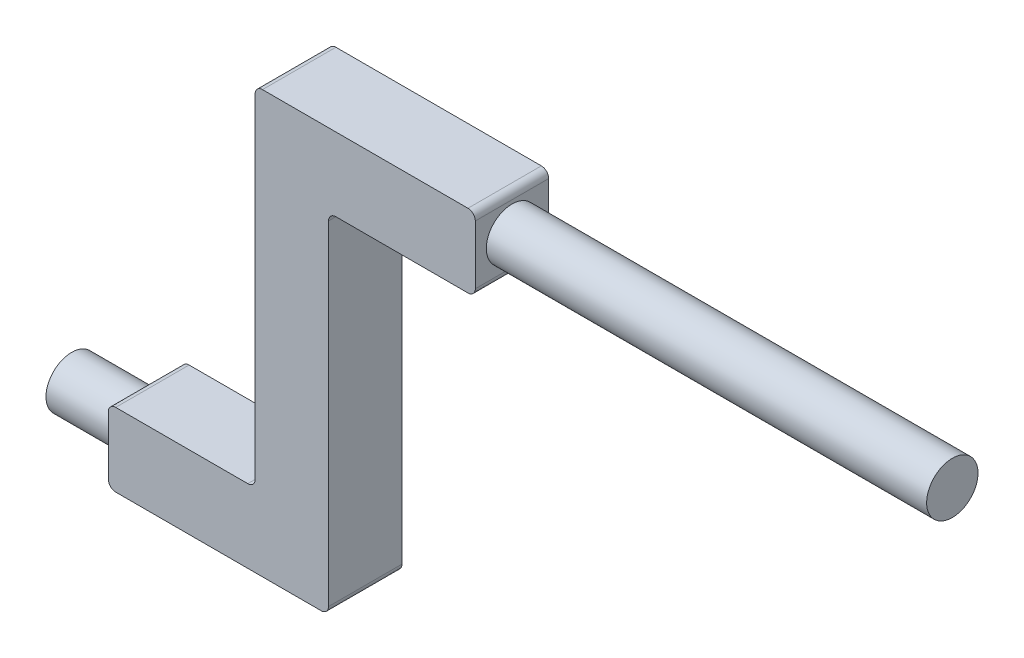
ISO-10303-21;
HEADER;
FILE_DESCRIPTION(('STEP AP214'),'2;1');
FILE_NAME('part.step','',(''),(''),'','','');
FILE_SCHEMA(('AUTOMOTIVE_DESIGN { 1 0 10303 214 1 1 1 1 }'));
ENDSEC;
DATA;
#1=APPLICATION_CONTEXT('core data for automotive mechanical design processes');
#2=APPLICATION_PROTOCOL_DEFINITION('international standard','automotive_design',2000,#1);
#3=PRODUCT_CONTEXT('',#1,'mechanical');
#4=PRODUCT('Part','Part','',(#3));
#5=PRODUCT_RELATED_PRODUCT_CATEGORY('part','',(#4));
#6=PRODUCT_DEFINITION_FORMATION('','',#4);
#7=PRODUCT_DEFINITION_CONTEXT('part definition',#1,'design');
#8=PRODUCT_DEFINITION('design','',#6,#7);
#9=PRODUCT_DEFINITION_SHAPE('','',#8);
#10=(LENGTH_UNIT() NAMED_UNIT(*) SI_UNIT(.MILLI.,.METRE.));
#11=(NAMED_UNIT(*) PLANE_ANGLE_UNIT() SI_UNIT($,.RADIAN.));
#12=(NAMED_UNIT(*) SI_UNIT($,.STERADIAN.) SOLID_ANGLE_UNIT());
#13=UNCERTAINTY_MEASURE_WITH_UNIT(LENGTH_MEASURE(1.E-05),#10,'distance_accuracy_value','');
#14=(GEOMETRIC_REPRESENTATION_CONTEXT(3) GLOBAL_UNCERTAINTY_ASSIGNED_CONTEXT((#13)) GLOBAL_UNIT_ASSIGNED_CONTEXT((#10,
#11,#12)) REPRESENTATION_CONTEXT('',''));
#15=CARTESIAN_POINT('',(0.,0.,0.));
#16=DIRECTION('',(0.,0.,1.));
#17=DIRECTION('',(1.,0.,0.));
#18=AXIS2_PLACEMENT_3D('',#15,#16,#17);
#19=CARTESIAN_POINT('',(19.,32.75,10.));
#20=DIRECTION('',(0.,0.,-1.));
#21=DIRECTION('',(-1.,0.,0.));
#22=AXIS2_PLACEMENT_3D('',#19,#20,#21);
#23=CYLINDRICAL_SURFACE('',#22,1.00000000000001);
#24=CARTESIAN_POINT('',(19.,32.75,0.));
#25=DIRECTION('',(0.,0.,1.));
#26=DIRECTION('',(-1.,0.,0.));
#27=AXIS2_PLACEMENT_3D('',#24,#25,#26);
#28=CIRCLE('',#27,1.00000000000001);
#29=CARTESIAN_POINT('',(20.,32.75,0.));
#30=VERTEX_POINT('',#29);
#31=CARTESIAN_POINT('',(19.,33.75,0.));
#32=VERTEX_POINT('',#31);
#33=EDGE_CURVE('E180',#30,#32,#28,.T.);
#34=ORIENTED_EDGE('',*,*,#33,.T.);
#35=DIRECTION('',(0.,0.,-1.));
#36=VECTOR('',#35,1.);
#37=CARTESIAN_POINT('',(19.,33.75,10.));
#38=LINE('',#37,#36);
#39=CARTESIAN_POINT('',(19.,33.75,10.));
#40=VERTEX_POINT('',#39);
#41=EDGE_CURVE('E248',#40,#32,#38,.T.);
#42=ORIENTED_EDGE('',*,*,#41,.F.);
#43=CARTESIAN_POINT('',(19.,32.75,10.));
#44=DIRECTION('',(0.,0.,1.));
#45=DIRECTION('',(-1.,0.,0.));
#46=AXIS2_PLACEMENT_3D('',#43,#44,#45);
#47=CIRCLE('',#46,1.00000000000001);
#48=CARTESIAN_POINT('',(20.,32.75,10.));
#49=VERTEX_POINT('',#48);
#50=EDGE_CURVE('E211',#49,#40,#47,.T.);
#51=ORIENTED_EDGE('',*,*,#50,.F.);
#52=DIRECTION('',(0.,0.,-1.));
#53=VECTOR('',#52,1.);
#54=CARTESIAN_POINT('',(20.,32.75,10.));
#55=LINE('',#54,#53);
#56=EDGE_CURVE('E176',#49,#30,#55,.T.);
#57=ORIENTED_EDGE('',*,*,#56,.T.);
#58=EDGE_LOOP('',(#34,#42,#51,#57));
#59=FACE_BOUND('',#58,.T.);
#60=ADVANCED_FACE('F35',(#59),#23,.T.);
#61=CARTESIAN_POINT('',(19.,33.75,10.));
#62=DIRECTION('',(0.,-1.,0.));
#63=DIRECTION('',(1.,0.,0.));
#64=AXIS2_PLACEMENT_3D('',#61,#62,#63);
#65=PLANE('',#64);
#66=DIRECTION('',(-1.,0.,0.));
#67=VECTOR('',#66,1.);
#68=CARTESIAN_POINT('',(19.,33.75,0.));
#69=LINE('',#68,#67);
#70=CARTESIAN_POINT('',(-8.99999999999998,33.75,0.));
#71=VERTEX_POINT('',#70);
#72=EDGE_CURVE('E183',#32,#71,#69,.T.);
#73=ORIENTED_EDGE('',*,*,#72,.T.);
#74=DIRECTION('',(0.,0.,-1.));
#75=VECTOR('',#74,1.);
#76=CARTESIAN_POINT('',(-8.99999999999998,33.75,10.));
#77=LINE('',#76,#75);
#78=CARTESIAN_POINT('',(-8.99999999999998,33.75,10.));
#79=VERTEX_POINT('',#78);
#80=EDGE_CURVE('E245',#79,#71,#77,.T.);
#81=ORIENTED_EDGE('',*,*,#80,.F.);
#82=DIRECTION('',(-1.,0.,0.));
#83=VECTOR('',#82,1.);
#84=CARTESIAN_POINT('',(19.,33.75,10.));
#85=LINE('',#84,#83);
#86=EDGE_CURVE('E119',#40,#79,#85,.T.);
#87=ORIENTED_EDGE('',*,*,#86,.F.);
#88=ORIENTED_EDGE('',*,*,#41,.T.);
#89=EDGE_LOOP('',(#73,#81,#87,#88));
#90=FACE_BOUND('',#89,.T.);
#91=ADVANCED_FACE('F266',(#90),#65,.F.);
#92=CARTESIAN_POINT('',(-8.99999999999998,32.75,10.));
#93=DIRECTION('',(0.,0.,-1.));
#94=DIRECTION('',(-1.,0.,0.));
#95=AXIS2_PLACEMENT_3D('',#92,#93,#94);
#96=CYLINDRICAL_SURFACE('',#95,0.999999999999997);
#97=CARTESIAN_POINT('',(-8.99999999999998,32.75,0.));
#98=DIRECTION('',(0.,0.,1.));
#99=DIRECTION('',(1.,0.,0.));
#100=AXIS2_PLACEMENT_3D('',#97,#98,#99);
#101=CIRCLE('',#100,0.999999999999997);
#102=CARTESIAN_POINT('',(-9.99999999999997,32.75,0.));
#103=VERTEX_POINT('',#102);
#104=EDGE_CURVE('E186',#71,#103,#101,.T.);
#105=ORIENTED_EDGE('',*,*,#104,.T.);
#106=DIRECTION('',(0.,0.,-1.));
#107=VECTOR('',#106,1.);
#108=CARTESIAN_POINT('',(-9.99999999999997,32.75,10.));
#109=LINE('',#108,#107);
#110=CARTESIAN_POINT('',(-9.99999999999997,32.75,10.));
#111=VERTEX_POINT('',#110);
#112=EDGE_CURVE('E242',#111,#103,#109,.T.);
#113=ORIENTED_EDGE('',*,*,#112,.F.);
#114=CARTESIAN_POINT('',(-8.99999999999998,32.75,10.));
#115=DIRECTION('',(0.,0.,1.));
#116=DIRECTION('',(1.,0.,0.));
#117=AXIS2_PLACEMENT_3D('',#114,#115,#116);
#118=CIRCLE('',#117,0.999999999999997);
#119=EDGE_CURVE('E281',#79,#111,#118,.T.);
#120=ORIENTED_EDGE('',*,*,#119,.F.);
#121=ORIENTED_EDGE('',*,*,#80,.T.);
#122=EDGE_LOOP('',(#105,#113,#120,#121));
#123=FACE_BOUND('',#122,.T.);
#124=ADVANCED_FACE('F271',(#123),#96,.T.);
#125=CARTESIAN_POINT('',(-9.99999999999998,32.75,10.));
#126=DIRECTION('',(1.,0.,0.));
#127=DIRECTION('',(0.,1.,0.));
#128=AXIS2_PLACEMENT_3D('',#125,#126,#127);
#129=PLANE('',#128);
#130=DIRECTION('',(0.,-1.,0.));
#131=VECTOR('',#130,1.);
#132=CARTESIAN_POINT('',(-9.99999999999998,32.75,0.));
#133=LINE('',#132,#131);
#134=CARTESIAN_POINT('',(-9.99999999999996,-12.75,0.));
#135=VERTEX_POINT('',#134);
#136=EDGE_CURVE('E188',#103,#135,#133,.T.);
#137=ORIENTED_EDGE('',*,*,#136,.T.);
#138=DIRECTION('',(0.,0.,-1.));
#139=VECTOR('',#138,1.);
#140=CARTESIAN_POINT('',(-9.99999999999996,-12.75,10.));
#141=LINE('',#140,#139);
#142=CARTESIAN_POINT('',(-9.99999999999996,-12.75,10.));
#143=VERTEX_POINT('',#142);
#144=EDGE_CURVE('E239',#143,#135,#141,.T.);
#145=ORIENTED_EDGE('',*,*,#144,.F.);
#146=DIRECTION('',(0.,-1.,0.));
#147=VECTOR('',#146,1.);
#148=CARTESIAN_POINT('',(-9.99999999999998,32.75,10.));
#149=LINE('',#148,#147);
#150=EDGE_CURVE('E283',#111,#143,#149,.T.);
#151=ORIENTED_EDGE('',*,*,#150,.F.);
#152=ORIENTED_EDGE('',*,*,#112,.T.);
#153=EDGE_LOOP('',(#137,#145,#151,#152));
#154=FACE_BOUND('',#153,.T.);
#155=ADVANCED_FACE('F349',(#154),#129,.F.);
#156=CARTESIAN_POINT('',(-11.,-12.75,10.));
#157=DIRECTION('',(0.,0.,-1.));
#158=DIRECTION('',(-1.,0.,0.));
#159=AXIS2_PLACEMENT_3D('',#156,#157,#158);
#160=CYLINDRICAL_SURFACE('',#159,0.999999999999999);
#161=CARTESIAN_POINT('',(-11.,-12.75,0.));
#162=DIRECTION('',(0.,0.,-1.));
#163=DIRECTION('',(-1.,0.,0.));
#164=AXIS2_PLACEMENT_3D('',#161,#162,#163);
#165=CIRCLE('',#164,0.999999999999999);
#166=CARTESIAN_POINT('',(-11.,-13.75,0.));
#167=VERTEX_POINT('',#166);
#168=EDGE_CURVE('E190',#135,#167,#165,.T.);
#169=ORIENTED_EDGE('',*,*,#168,.T.);
#170=DIRECTION('',(0.,0.,-1.));
#171=VECTOR('',#170,1.);
#172=CARTESIAN_POINT('',(-11.,-13.75,10.));
#173=LINE('',#172,#171);
#174=CARTESIAN_POINT('',(-11.,-13.75,10.));
#175=VERTEX_POINT('',#174);
#176=EDGE_CURVE('E236',#175,#167,#173,.T.);
#177=ORIENTED_EDGE('',*,*,#176,.F.);
#178=CARTESIAN_POINT('',(-11.,-12.75,10.));
#179=DIRECTION('',(0.,0.,-1.));
#180=DIRECTION('',(-1.,0.,0.));
#181=AXIS2_PLACEMENT_3D('',#178,#179,#180);
#182=CIRCLE('',#181,0.999999999999999);
#183=EDGE_CURVE('E285',#143,#175,#182,.T.);
#184=ORIENTED_EDGE('',*,*,#183,.F.);
#185=ORIENTED_EDGE('',*,*,#144,.T.);
#186=EDGE_LOOP('',(#169,#177,#184,#185));
#187=FACE_BOUND('',#186,.T.);
#188=ADVANCED_FACE('F345',(#187),#160,.F.);
#189=CARTESIAN_POINT('',(-11.,-13.75,10.));
#190=DIRECTION('',(0.,-1.,0.));
#191=DIRECTION('',(1.,0.,0.));
#192=AXIS2_PLACEMENT_3D('',#189,#190,#191);
#193=PLANE('',#192);
#194=DIRECTION('',(-1.,0.,0.));
#195=VECTOR('',#194,1.);
#196=CARTESIAN_POINT('',(-11.,-13.75,0.));
#197=LINE('',#196,#195);
#198=CARTESIAN_POINT('',(-28.9999999999999,-13.75,0.));
#199=VERTEX_POINT('',#198);
#200=EDGE_CURVE('E192',#167,#199,#197,.T.);
#201=ORIENTED_EDGE('',*,*,#200,.T.);
#202=DIRECTION('',(0.,0.,-1.));
#203=VECTOR('',#202,1.);
#204=CARTESIAN_POINT('',(-28.9999999999999,-13.75,10.));
#205=LINE('',#204,#203);
#206=CARTESIAN_POINT('',(-28.9999999999999,-13.75,10.));
#207=VERTEX_POINT('',#206);
#208=EDGE_CURVE('E233',#207,#199,#205,.T.);
#209=ORIENTED_EDGE('',*,*,#208,.F.);
#210=DIRECTION('',(-1.,0.,0.));
#211=VECTOR('',#210,1.);
#212=CARTESIAN_POINT('',(-11.,-13.75,10.));
#213=LINE('',#212,#211);
#214=EDGE_CURVE('E291',#175,#207,#213,.T.);
#215=ORIENTED_EDGE('',*,*,#214,.F.);
#216=ORIENTED_EDGE('',*,*,#176,.T.);
#217=EDGE_LOOP('',(#201,#209,#215,#216));
#218=FACE_BOUND('',#217,.T.);
#219=ADVANCED_FACE('F341',(#218),#193,.F.);
#220=CARTESIAN_POINT('',(-28.9999999999999,-14.75,10.));
#221=DIRECTION('',(0.,0.,-1.));
#222=DIRECTION('',(-1.,0.,0.));
#223=AXIS2_PLACEMENT_3D('',#220,#221,#222);
#224=CYLINDRICAL_SURFACE('',#223,0.999999999999999);
#225=CARTESIAN_POINT('',(-28.9999999999999,-14.75,0.));
#226=DIRECTION('',(0.,0.,1.));
#227=DIRECTION('',(-1.,0.,0.));
#228=AXIS2_PLACEMENT_3D('',#225,#226,#227);
#229=CIRCLE('',#228,0.999999999999999);
#230=CARTESIAN_POINT('',(-29.9999999999999,-14.75,0.));
#231=VERTEX_POINT('',#230);
#232=EDGE_CURVE('E194',#199,#231,#229,.T.);
#233=ORIENTED_EDGE('',*,*,#232,.T.);
#234=DIRECTION('',(0.,0.,-1.));
#235=VECTOR('',#234,1.);
#236=CARTESIAN_POINT('',(-29.9999999999999,-14.75,10.));
#237=LINE('',#236,#235);
#238=CARTESIAN_POINT('',(-29.9999999999999,-14.75,10.));
#239=VERTEX_POINT('',#238);
#240=EDGE_CURVE('E230',#239,#231,#237,.T.);
#241=ORIENTED_EDGE('',*,*,#240,.F.);
#242=CARTESIAN_POINT('',(-28.9999999999999,-14.75,10.));
#243=DIRECTION('',(0.,0.,1.));
#244=DIRECTION('',(-1.,0.,0.));
#245=AXIS2_PLACEMENT_3D('',#242,#243,#244);
#246=CIRCLE('',#245,0.999999999999999);
#247=EDGE_CURVE('E293',#207,#239,#246,.T.);
#248=ORIENTED_EDGE('',*,*,#247,.F.);
#249=ORIENTED_EDGE('',*,*,#208,.T.);
#250=EDGE_LOOP('',(#233,#241,#248,#249));
#251=FACE_BOUND('',#250,.T.);
#252=ADVANCED_FACE('F337',(#251),#224,.T.);
#253=CARTESIAN_POINT('',(-29.9999999999999,-14.75,10.));
#254=DIRECTION('',(1.,0.,0.));
#255=DIRECTION('',(0.,1.,0.));
#256=AXIS2_PLACEMENT_3D('',#253,#254,#255);
#257=PLANE('',#256);
#258=CARTESIAN_POINT('',(-29.9999999999999,-18.75,5.));
#259=DIRECTION('',(1.,0.,0.));
#260=DIRECTION('',(0.,1.,0.));
#261=AXIS2_PLACEMENT_3D('',#258,#259,#260);
#262=CIRCLE('',#261,3.5);
#263=CARTESIAN_POINT('',(-29.9999999999999,-15.25,5.));
#264=VERTEX_POINT('',#263);
#265=EDGE_CURVE('E11',#264,#264,#262,.F.);
#266=ORIENTED_EDGE('',*,*,#265,.F.);
#267=EDGE_LOOP('',(#266));
#268=FACE_BOUND('',#267,.T.);
#269=DIRECTION('',(0.,-1.,0.));
#270=VECTOR('',#269,1.);
#271=CARTESIAN_POINT('',(-29.9999999999999,-14.75,0.));
#272=LINE('',#271,#270);
#273=CARTESIAN_POINT('',(-29.9999999999999,-22.75,0.));
#274=VERTEX_POINT('',#273);
#275=EDGE_CURVE('E196',#231,#274,#272,.T.);
#276=ORIENTED_EDGE('',*,*,#275,.T.);
#277=DIRECTION('',(0.,0.,-1.));
#278=VECTOR('',#277,1.);
#279=CARTESIAN_POINT('',(-29.9999999999999,-22.75,10.));
#280=LINE('',#279,#278);
#281=CARTESIAN_POINT('',(-29.9999999999999,-22.75,10.));
#282=VERTEX_POINT('',#281);
#283=EDGE_CURVE('E227',#282,#274,#280,.T.);
#284=ORIENTED_EDGE('',*,*,#283,.F.);
#285=DIRECTION('',(0.,-1.,0.));
#286=VECTOR('',#285,1.);
#287=CARTESIAN_POINT('',(-29.9999999999999,-14.75,10.));
#288=LINE('',#287,#286);
#289=EDGE_CURVE('E295',#239,#282,#288,.T.);
#290=ORIENTED_EDGE('',*,*,#289,.F.);
#291=ORIENTED_EDGE('',*,*,#240,.T.);
#292=EDGE_LOOP('',(#276,#284,#290,#291));
#293=FACE_BOUND('',#292,.T.);
#294=ADVANCED_FACE('F332',(#268,#293),#257,.F.);
#295=CARTESIAN_POINT('',(-28.9999999999999,-22.75,10.));
#296=DIRECTION('',(0.,0.,-1.));
#297=DIRECTION('',(-1.,0.,0.));
#298=AXIS2_PLACEMENT_3D('',#295,#296,#297);
#299=CYLINDRICAL_SURFACE('',#298,1.);
#300=CARTESIAN_POINT('',(-28.9999999999999,-22.75,0.));
#301=DIRECTION('',(0.,0.,1.));
#302=DIRECTION('',(1.,0.,0.));
#303=AXIS2_PLACEMENT_3D('',#300,#301,#302);
#304=CIRCLE('',#303,1.);
#305=CARTESIAN_POINT('',(-28.9999999999999,-23.75,0.));
#306=VERTEX_POINT('',#305);
#307=EDGE_CURVE('E198',#274,#306,#304,.T.);
#308=ORIENTED_EDGE('',*,*,#307,.T.);
#309=DIRECTION('',(0.,0.,-1.));
#310=VECTOR('',#309,1.);
#311=CARTESIAN_POINT('',(-28.9999999999999,-23.75,10.));
#312=LINE('',#311,#310);
#313=CARTESIAN_POINT('',(-28.9999999999999,-23.75,10.));
#314=VERTEX_POINT('',#313);
#315=EDGE_CURVE('E224',#314,#306,#312,.T.);
#316=ORIENTED_EDGE('',*,*,#315,.F.);
#317=CARTESIAN_POINT('',(-28.9999999999999,-22.75,10.));
#318=DIRECTION('',(0.,0.,1.));
#319=DIRECTION('',(1.,0.,0.));
#320=AXIS2_PLACEMENT_3D('',#317,#318,#319);
#321=CIRCLE('',#320,1.);
#322=EDGE_CURVE('E297',#282,#314,#321,.T.);
#323=ORIENTED_EDGE('',*,*,#322,.F.);
#324=ORIENTED_EDGE('',*,*,#283,.T.);
#325=EDGE_LOOP('',(#308,#316,#323,#324));
#326=FACE_BOUND('',#325,.T.);
#327=ADVANCED_FACE('F326',(#326),#299,.T.);
#328=CARTESIAN_POINT('',(-28.9999999999999,-23.75,10.));
#329=DIRECTION('',(0.,1.,0.));
#330=DIRECTION('',(-1.,0.,0.));
#331=AXIS2_PLACEMENT_3D('',#328,#329,#330);
#332=PLANE('',#331);
#333=DIRECTION('',(1.,0.,0.));
#334=VECTOR('',#333,1.);
#335=CARTESIAN_POINT('',(-28.9999999999999,-23.75,0.));
#336=LINE('',#335,#334);
#337=CARTESIAN_POINT('',(-0.999999999999989,-23.75,0.));
#338=VERTEX_POINT('',#337);
#339=EDGE_CURVE('E200',#306,#338,#336,.T.);
#340=ORIENTED_EDGE('',*,*,#339,.T.);
#341=DIRECTION('',(0.,0.,-1.));
#342=VECTOR('',#341,1.);
#343=CARTESIAN_POINT('',(-0.999999999999989,-23.75,10.));
#344=LINE('',#343,#342);
#345=CARTESIAN_POINT('',(-0.999999999999989,-23.75,10.));
#346=VERTEX_POINT('',#345);
#347=EDGE_CURVE('E221',#346,#338,#344,.T.);
#348=ORIENTED_EDGE('',*,*,#347,.F.);
#349=DIRECTION('',(1.,0.,0.));
#350=VECTOR('',#349,1.);
#351=CARTESIAN_POINT('',(-28.9999999999999,-23.75,10.));
#352=LINE('',#351,#350);
#353=EDGE_CURVE('E299',#314,#346,#352,.T.);
#354=ORIENTED_EDGE('',*,*,#353,.F.);
#355=ORIENTED_EDGE('',*,*,#315,.T.);
#356=EDGE_LOOP('',(#340,#348,#354,#355));
#357=FACE_BOUND('',#356,.T.);
#358=ADVANCED_FACE('F322',(#357),#332,.F.);
#359=CARTESIAN_POINT('',(-0.99999999999999,-22.75,10.));
#360=DIRECTION('',(0.,0.,-1.));
#361=DIRECTION('',(-1.,0.,0.));
#362=AXIS2_PLACEMENT_3D('',#359,#360,#361);
#363=CYLINDRICAL_SURFACE('',#362,0.999999999999997);
#364=CARTESIAN_POINT('',(-0.99999999999999,-22.75,0.));
#365=DIRECTION('',(0.,0.,1.));
#366=DIRECTION('',(-1.,0.,0.));
#367=AXIS2_PLACEMENT_3D('',#364,#365,#366);
#368=CIRCLE('',#367,0.999999999999997);
#369=CARTESIAN_POINT('',(0.,-22.75,0.));
#370=VERTEX_POINT('',#369);
#371=EDGE_CURVE('E202',#338,#370,#368,.T.);
#372=ORIENTED_EDGE('',*,*,#371,.T.);
#373=DIRECTION('',(0.,0.,-1.));
#374=VECTOR('',#373,1.);
#375=CARTESIAN_POINT('',(0.,-22.75,10.));
#376=LINE('',#375,#374);
#377=CARTESIAN_POINT('',(0.,-22.75,10.));
#378=VERTEX_POINT('',#377);
#379=EDGE_CURVE('E218',#378,#370,#376,.T.);
#380=ORIENTED_EDGE('',*,*,#379,.F.);
#381=CARTESIAN_POINT('',(-0.99999999999999,-22.75,10.));
#382=DIRECTION('',(0.,0.,1.));
#383=DIRECTION('',(-1.,0.,0.));
#384=AXIS2_PLACEMENT_3D('',#381,#382,#383);
#385=CIRCLE('',#384,0.999999999999997);
#386=EDGE_CURVE('E301',#346,#378,#385,.T.);
#387=ORIENTED_EDGE('',*,*,#386,.F.);
#388=ORIENTED_EDGE('',*,*,#347,.T.);
#389=EDGE_LOOP('',(#372,#380,#387,#388));
#390=FACE_BOUND('',#389,.T.);
#391=ADVANCED_FACE('F318',(#390),#363,.T.);
#392=CARTESIAN_POINT('',(0.,22.75,10.));
#393=DIRECTION('',(-1.,0.,0.));
#394=DIRECTION('',(0.,-1.,0.));
#395=AXIS2_PLACEMENT_3D('',#392,#393,#394);
#396=PLANE('',#395);
#397=DIRECTION('',(0.,1.,0.));
#398=VECTOR('',#397,1.);
#399=CARTESIAN_POINT('',(0.,22.75,0.));
#400=LINE('',#399,#398);
#401=CARTESIAN_POINT('',(0.,22.75,0.));
#402=VERTEX_POINT('',#401);
#403=EDGE_CURVE('E204',#370,#402,#400,.T.);
#404=ORIENTED_EDGE('',*,*,#403,.T.);
#405=DIRECTION('',(0.,0.,-1.));
#406=VECTOR('',#405,1.);
#407=CARTESIAN_POINT('',(0.,22.75,10.));
#408=LINE('',#407,#406);
#409=CARTESIAN_POINT('',(0.,22.75,10.));
#410=VERTEX_POINT('',#409);
#411=EDGE_CURVE('E215',#410,#402,#408,.T.);
#412=ORIENTED_EDGE('',*,*,#411,.F.);
#413=DIRECTION('',(0.,1.,0.));
#414=VECTOR('',#413,1.);
#415=CARTESIAN_POINT('',(0.,22.75,10.));
#416=LINE('',#415,#414);
#417=EDGE_CURVE('E303',#378,#410,#416,.T.);
#418=ORIENTED_EDGE('',*,*,#417,.F.);
#419=ORIENTED_EDGE('',*,*,#379,.T.);
#420=EDGE_LOOP('',(#404,#412,#418,#419));
#421=FACE_BOUND('',#420,.T.);
#422=ADVANCED_FACE('F309',(#421),#396,.F.);
#423=CARTESIAN_POINT('',(0.999999999999996,22.75,10.));
#424=DIRECTION('',(0.,0.,-1.));
#425=DIRECTION('',(-1.,0.,0.));
#426=AXIS2_PLACEMENT_3D('',#423,#424,#425);
#427=CYLINDRICAL_SURFACE('',#426,0.999999999999988);
#428=CARTESIAN_POINT('',(0.999999999999996,22.75,0.));
#429=DIRECTION('',(0.,0.,-1.));
#430=DIRECTION('',(1.,0.,0.));
#431=AXIS2_PLACEMENT_3D('',#428,#429,#430);
#432=CIRCLE('',#431,0.999999999999988);
#433=CARTESIAN_POINT('',(0.999999999999996,23.75,0.));
#434=VERTEX_POINT('',#433);
#435=EDGE_CURVE('E206',#402,#434,#432,.T.);
#436=ORIENTED_EDGE('',*,*,#435,.T.);
#437=DIRECTION('',(0.,0.,-1.));
#438=VECTOR('',#437,1.);
#439=CARTESIAN_POINT('',(0.999999999999996,23.75,10.));
#440=LINE('',#439,#438);
#441=CARTESIAN_POINT('',(0.999999999999996,23.75,10.));
#442=VERTEX_POINT('',#441);
#443=EDGE_CURVE('E171',#442,#434,#440,.T.);
#444=ORIENTED_EDGE('',*,*,#443,.F.);
#445=CARTESIAN_POINT('',(0.999999999999996,22.75,10.));
#446=DIRECTION('',(0.,0.,-1.));
#447=DIRECTION('',(1.,0.,0.));
#448=AXIS2_PLACEMENT_3D('',#445,#446,#447);
#449=CIRCLE('',#448,0.999999999999988);
#450=EDGE_CURVE('E162',#410,#442,#449,.T.);
#451=ORIENTED_EDGE('',*,*,#450,.F.);
#452=ORIENTED_EDGE('',*,*,#411,.T.);
#453=EDGE_LOOP('',(#436,#444,#451,#452));
#454=FACE_BOUND('',#453,.T.);
#455=ADVANCED_FACE('F313',(#454),#427,.F.);
#456=CARTESIAN_POINT('',(0.999999999999996,23.75,10.));
#457=DIRECTION('',(0.,1.,0.));
#458=DIRECTION('',(-1.,0.,0.));
#459=AXIS2_PLACEMENT_3D('',#456,#457,#458);
#460=PLANE('',#459);
#461=DIRECTION('',(1.,0.,0.));
#462=VECTOR('',#461,1.);
#463=CARTESIAN_POINT('',(0.999999999999996,23.75,0.));
#464=LINE('',#463,#462);
#465=CARTESIAN_POINT('',(19.,23.75,0.));
#466=VERTEX_POINT('',#465);
#467=EDGE_CURVE('E170',#434,#466,#464,.T.);
#468=ORIENTED_EDGE('',*,*,#467,.T.);
#469=DIRECTION('',(0.,0.,-1.));
#470=VECTOR('',#469,1.);
#471=CARTESIAN_POINT('',(19.,23.75,10.));
#472=LINE('',#471,#470);
#473=CARTESIAN_POINT('',(19.,23.75,10.));
#474=VERTEX_POINT('',#473);
#475=EDGE_CURVE('E167',#474,#466,#472,.T.);
#476=ORIENTED_EDGE('',*,*,#475,.F.);
#477=DIRECTION('',(1.,0.,0.));
#478=VECTOR('',#477,1.);
#479=CARTESIAN_POINT('',(0.999999999999996,23.75,10.));
#480=LINE('',#479,#478);
#481=EDGE_CURVE('E156',#442,#474,#480,.T.);
#482=ORIENTED_EDGE('',*,*,#481,.F.);
#483=ORIENTED_EDGE('',*,*,#443,.T.);
#484=EDGE_LOOP('',(#468,#476,#482,#483));
#485=FACE_BOUND('',#484,.T.);
#486=ADVANCED_FACE('F168',(#485),#460,.F.);
#487=CARTESIAN_POINT('',(19.,24.75,10.));
#488=DIRECTION('',(0.,0.,-1.));
#489=DIRECTION('',(-1.,0.,0.));
#490=AXIS2_PLACEMENT_3D('',#487,#488,#489);
#491=CYLINDRICAL_SURFACE('',#490,1.00000000000001);
#492=CARTESIAN_POINT('',(19.,24.75,0.));
#493=DIRECTION('',(0.,0.,1.));
#494=DIRECTION('',(-1.,0.,0.));
#495=AXIS2_PLACEMENT_3D('',#492,#493,#494);
#496=CIRCLE('',#495,1.00000000000001);
#497=CARTESIAN_POINT('',(20.,24.75,0.));
#498=VERTEX_POINT('',#497);
#499=EDGE_CURVE('E104',#466,#498,#496,.T.);
#500=ORIENTED_EDGE('',*,*,#499,.T.);
#501=DIRECTION('',(0.,0.,-1.));
#502=VECTOR('',#501,1.);
#503=CARTESIAN_POINT('',(20.,24.75,10.));
#504=LINE('',#503,#502);
#505=CARTESIAN_POINT('',(20.,24.75,10.));
#506=VERTEX_POINT('',#505);
#507=EDGE_CURVE('E172',#506,#498,#504,.T.);
#508=ORIENTED_EDGE('',*,*,#507,.F.);
#509=CARTESIAN_POINT('',(19.,24.75,10.));
#510=DIRECTION('',(0.,0.,1.));
#511=DIRECTION('',(-1.,0.,0.));
#512=AXIS2_PLACEMENT_3D('',#509,#510,#511);
#513=CIRCLE('',#512,1.00000000000001);
#514=EDGE_CURVE('E160',#474,#506,#513,.T.);
#515=ORIENTED_EDGE('',*,*,#514,.F.);
#516=ORIENTED_EDGE('',*,*,#475,.T.);
#517=EDGE_LOOP('',(#500,#508,#515,#516));
#518=FACE_BOUND('',#517,.T.);
#519=ADVANCED_FACE('F174',(#518),#491,.T.);
#520=CARTESIAN_POINT('',(20.,24.75,10.));
#521=DIRECTION('',(-1.,0.,0.));
#522=DIRECTION('',(0.,-1.,0.));
#523=AXIS2_PLACEMENT_3D('',#520,#521,#522);
#524=PLANE('',#523);
#525=CARTESIAN_POINT('',(20.,28.75,5.));
#526=DIRECTION('',(-1.,0.,0.));
#527=DIRECTION('',(0.,-1.,0.));
#528=AXIS2_PLACEMENT_3D('',#525,#526,#527);
#529=CIRCLE('',#528,3.5);
#530=CARTESIAN_POINT('',(20.,25.25,5.));
#531=VERTEX_POINT('',#530);
#532=EDGE_CURVE('E43',#531,#531,#529,.F.);
#533=ORIENTED_EDGE('',*,*,#532,.F.);
#534=EDGE_LOOP('',(#533));
#535=FACE_BOUND('',#534,.T.);
#536=DIRECTION('',(0.,1.,0.));
#537=VECTOR('',#536,1.);
#538=CARTESIAN_POINT('',(20.,24.75,0.));
#539=LINE('',#538,#537);
#540=EDGE_CURVE('E110',#498,#30,#539,.T.);
#541=ORIENTED_EDGE('',*,*,#540,.T.);
#542=ORIENTED_EDGE('',*,*,#56,.F.);
#543=DIRECTION('',(0.,1.,0.));
#544=VECTOR('',#543,1.);
#545=CARTESIAN_POINT('',(20.,24.75,10.));
#546=LINE('',#545,#544);
#547=EDGE_CURVE('E51',#506,#49,#546,.T.);
#548=ORIENTED_EDGE('',*,*,#547,.F.);
#549=ORIENTED_EDGE('',*,*,#507,.T.);
#550=EDGE_LOOP('',(#541,#542,#548,#549));
#551=FACE_BOUND('',#550,.T.);
#552=ADVANCED_FACE('F254',(#535,#551),#524,.F.);
#553=CARTESIAN_POINT('',(19.,32.75,10.));
#554=DIRECTION('',(0.,0.,-1.));
#555=DIRECTION('',(-1.,0.,0.));
#556=AXIS2_PLACEMENT_3D('',#553,#554,#555);
#557=PLANE('',#556);
#558=ORIENTED_EDGE('',*,*,#50,.T.);
#559=ORIENTED_EDGE('',*,*,#86,.T.);
#560=ORIENTED_EDGE('',*,*,#119,.T.);
#561=ORIENTED_EDGE('',*,*,#150,.T.);
#562=ORIENTED_EDGE('',*,*,#183,.T.);
#563=ORIENTED_EDGE('',*,*,#214,.T.);
#564=ORIENTED_EDGE('',*,*,#247,.T.);
#565=ORIENTED_EDGE('',*,*,#289,.T.);
#566=ORIENTED_EDGE('',*,*,#322,.T.);
#567=ORIENTED_EDGE('',*,*,#353,.T.);
#568=ORIENTED_EDGE('',*,*,#386,.T.);
#569=ORIENTED_EDGE('',*,*,#417,.T.);
#570=ORIENTED_EDGE('',*,*,#450,.T.);
#571=ORIENTED_EDGE('',*,*,#481,.T.);
#572=ORIENTED_EDGE('',*,*,#514,.T.);
#573=ORIENTED_EDGE('',*,*,#547,.T.);
#574=EDGE_LOOP('',(#558,#559,#560,#561,#562,#563,#564,#565,#566,#567,#568,#569,#570,#571,#572,#573));
#575=FACE_BOUND('',#574,.T.);
#576=ADVANCED_FACE('F158',(#575),#557,.F.);
#577=CARTESIAN_POINT('',(19.,32.75,0.));
#578=DIRECTION('',(0.,0.,-1.));
#579=DIRECTION('',(-1.,0.,0.));
#580=AXIS2_PLACEMENT_3D('',#577,#578,#579);
#581=PLANE('',#580);
#582=ORIENTED_EDGE('',*,*,#33,.F.);
#583=ORIENTED_EDGE('',*,*,#540,.F.);
#584=ORIENTED_EDGE('',*,*,#499,.F.);
#585=ORIENTED_EDGE('',*,*,#467,.F.);
#586=ORIENTED_EDGE('',*,*,#435,.F.);
#587=ORIENTED_EDGE('',*,*,#403,.F.);
#588=ORIENTED_EDGE('',*,*,#371,.F.);
#589=ORIENTED_EDGE('',*,*,#339,.F.);
#590=ORIENTED_EDGE('',*,*,#307,.F.);
#591=ORIENTED_EDGE('',*,*,#275,.F.);
#592=ORIENTED_EDGE('',*,*,#232,.F.);
#593=ORIENTED_EDGE('',*,*,#200,.F.);
#594=ORIENTED_EDGE('',*,*,#168,.F.);
#595=ORIENTED_EDGE('',*,*,#136,.F.);
#596=ORIENTED_EDGE('',*,*,#104,.F.);
#597=ORIENTED_EDGE('',*,*,#72,.F.);
#598=EDGE_LOOP('',(#582,#583,#584,#585,#586,#587,#588,#589,#590,#591,#592,#593,#594,#595,#596,#597));
#599=FACE_BOUND('',#598,.T.);
#600=ADVANCED_FACE('F261',(#599),#581,.T.);
#601=CARTESIAN_POINT('',(80.,28.75,5.));
#602=DIRECTION('',(-1.,0.,0.));
#603=DIRECTION('',(0.,-1.,0.));
#604=AXIS2_PLACEMENT_3D('',#601,#602,#603);
#605=CYLINDRICAL_SURFACE('',#604,3.5);
#606=CARTESIAN_POINT('',(80.,28.75,5.));
#607=DIRECTION('',(1.,0.,0.));
#608=DIRECTION('',(0.,1.,0.));
#609=AXIS2_PLACEMENT_3D('',#606,#607,#608);
#610=CIRCLE('',#609,3.5);
#611=CARTESIAN_POINT('',(80.,25.25,5.));
#612=VERTEX_POINT('',#611);
#613=EDGE_CURVE('E184',#612,#612,#610,.T.);
#614=CARTESIAN_POINT('',(80.,25.25,5.));
#615=CARTESIAN_POINT('',(79.375,25.25,5.));
#616=CARTESIAN_POINT('',(78.75,25.25,5.));
#617=CARTESIAN_POINT('',(77.5,25.25,5.));
#618=CARTESIAN_POINT('',(76.875,25.25,5.));
#619=CARTESIAN_POINT('',(75.625,25.25,5.));
#620=CARTESIAN_POINT('',(75.,25.25,5.));
#621=CARTESIAN_POINT('',(73.75,25.25,5.));
#622=CARTESIAN_POINT('',(73.125,25.25,5.));
#623=CARTESIAN_POINT('',(71.875,25.25,5.));
#624=CARTESIAN_POINT('',(71.25,25.25,5.));
#625=CARTESIAN_POINT('',(70.,25.25,5.));
#626=CARTESIAN_POINT('',(69.375,25.25,5.));
#627=CARTESIAN_POINT('',(68.125,25.25,5.));
#628=CARTESIAN_POINT('',(67.5,25.25,5.));
#629=CARTESIAN_POINT('',(66.25,25.25,5.));
#630=CARTESIAN_POINT('',(65.625,25.25,5.));
#631=CARTESIAN_POINT('',(64.375,25.25,5.));
#632=CARTESIAN_POINT('',(63.75,25.25,5.));
#633=CARTESIAN_POINT('',(62.5,25.25,5.));
#634=CARTESIAN_POINT('',(61.875,25.25,5.));
#635=CARTESIAN_POINT('',(60.625,25.25,5.));
#636=CARTESIAN_POINT('',(60.,25.25,5.));
#637=CARTESIAN_POINT('',(58.75,25.25,5.));
#638=CARTESIAN_POINT('',(58.125,25.25,5.));
#639=CARTESIAN_POINT('',(56.875,25.25,5.));
#640=CARTESIAN_POINT('',(56.25,25.25,5.));
#641=CARTESIAN_POINT('',(55.,25.25,5.));
#642=CARTESIAN_POINT('',(54.375,25.25,5.));
#643=CARTESIAN_POINT('',(53.125,25.25,5.));
#644=CARTESIAN_POINT('',(52.5,25.25,5.));
#645=CARTESIAN_POINT('',(51.25,25.25,5.));
#646=CARTESIAN_POINT('',(50.625,25.25,5.));
#647=CARTESIAN_POINT('',(49.375,25.25,5.));
#648=CARTESIAN_POINT('',(48.75,25.25,5.));
#649=CARTESIAN_POINT('',(47.5,25.25,5.));
#650=CARTESIAN_POINT('',(46.875,25.25,5.));
#651=CARTESIAN_POINT('',(45.625,25.25,5.));
#652=CARTESIAN_POINT('',(45.,25.25,5.));
#653=CARTESIAN_POINT('',(43.75,25.25,5.));
#654=CARTESIAN_POINT('',(43.125,25.25,5.));
#655=CARTESIAN_POINT('',(41.875,25.25,5.));
#656=CARTESIAN_POINT('',(41.25,25.25,5.));
#657=CARTESIAN_POINT('',(40.,25.25,5.));
#658=CARTESIAN_POINT('',(39.375,25.25,5.));
#659=CARTESIAN_POINT('',(38.125,25.25,5.));
#660=CARTESIAN_POINT('',(37.5,25.25,5.));
#661=CARTESIAN_POINT('',(36.25,25.25,5.));
#662=CARTESIAN_POINT('',(35.625,25.25,5.));
#663=CARTESIAN_POINT('',(34.375,25.25,5.));
#664=CARTESIAN_POINT('',(33.75,25.25,5.));
#665=CARTESIAN_POINT('',(32.5,25.25,5.));
#666=CARTESIAN_POINT('',(31.875,25.25,5.));
#667=CARTESIAN_POINT('',(30.625,25.25,5.));
#668=CARTESIAN_POINT('',(30.,25.25,5.));
#669=CARTESIAN_POINT('',(28.75,25.25,5.));
#670=CARTESIAN_POINT('',(28.125,25.25,5.));
#671=CARTESIAN_POINT('',(26.875,25.25,5.));
#672=CARTESIAN_POINT('',(26.25,25.25,5.));
#673=CARTESIAN_POINT('',(25.,25.25,5.));
#674=CARTESIAN_POINT('',(24.375,25.25,5.));
#675=CARTESIAN_POINT('',(23.125,25.25,5.));
#676=CARTESIAN_POINT('',(22.5,25.25,5.));
#677=CARTESIAN_POINT('',(21.25,25.25,5.));
#678=CARTESIAN_POINT('',(20.625,25.25,5.));
#679=CARTESIAN_POINT('',(20.,25.25,5.));
#680=B_SPLINE_CURVE_WITH_KNOTS('',3,(#614,#615,#616,#617,#618,#619,#620,#621,#622,#623,#624,
#625,#626,#627,#628,#629,#630,#631,#632,#633,#634,#635,#636,#637,#638,#639,#640,#641,#642,#643,
#644,#645,#646,#647,#648,#649,#650,#651,#652,#653,#654,#655,#656,#657,#658,#659,#660,#661,#662,
#663,#664,#665,#666,#667,#668,#669,#670,#671,#672,#673,#674,#675,#676,#677,#678,#679),
.UNSPECIFIED.,.F.,.F.,(4,2,2,2,2,2,2,2,2,2,2,2,2,2,2,2,2,2,2,2,2,2,2,2,2,2,2,2,2,2,2,2,4),(0.,
1.87499999999999,3.74999999999999,5.62499999999999,7.49999999999999,9.37499999999999,11.25,
13.125,15.,16.875,18.75,20.625,22.5,24.375,26.25,28.125,30.,31.875,33.75,35.625,37.5,39.375,
41.25,43.125,45.,46.875,48.75,50.625,52.5,54.375,56.25,58.125,60.),.UNSPECIFIED.);
#681=EDGE_CURVE('BSEAM252',#612,#531,#680,.T.);
#682=ORIENTED_EDGE('',*,*,#613,.F.);
#683=ORIENTED_EDGE('',*,*,#532,.T.);
#684=ORIENTED_EDGE('',*,*,#681,.T.);
#685=ORIENTED_EDGE('',*,*,#681,.F.);
#686=EDGE_LOOP('',(#682,#684,#683,#685));
#687=FACE_BOUND('',#686,.T.);
#688=ADVANCED_FACE('F252',(#687),#605,.T.);
#689=CARTESIAN_POINT('',(80.,28.75,5.));
#690=DIRECTION('',(1.,0.,0.));
#691=DIRECTION('',(0.,1.,0.));
#692=AXIS2_PLACEMENT_3D('',#689,#690,#691);
#693=PLANE('',#692);
#694=ORIENTED_EDGE('',*,*,#613,.T.);
#695=EDGE_LOOP('',(#694));
#696=FACE_BOUND('',#695,.T.);
#697=ADVANCED_FACE('F411',(#696),#693,.T.);
#698=CARTESIAN_POINT('',(-39.9999999999999,-18.75,5.));
#699=DIRECTION('',(1.,0.,0.));
#700=DIRECTION('',(0.,1.,0.));
#701=AXIS2_PLACEMENT_3D('',#698,#699,#700);
#702=CYLINDRICAL_SURFACE('',#701,3.5);
#703=CARTESIAN_POINT('',(-39.9999999999999,-18.75,5.));
#704=DIRECTION('',(-1.,0.,0.));
#705=DIRECTION('',(0.,-1.,0.));
#706=AXIS2_PLACEMENT_3D('',#703,#704,#705);
#707=CIRCLE('',#706,3.5);
#708=CARTESIAN_POINT('',(-39.9999999999999,-22.25,5.));
#709=VERTEX_POINT('',#708);
#710=EDGE_CURVE('E455',#709,#709,#707,.T.);
#711=ORIENTED_EDGE('',*,*,#710,.F.);
#712=EDGE_LOOP('',(#711));
#713=FACE_BOUND('',#712,.T.);
#714=ORIENTED_EDGE('',*,*,#265,.T.);
#715=EDGE_LOOP('',(#714));
#716=FACE_BOUND('',#715,.T.);
#717=ADVANCED_FACE('F421',(#713,#716),#702,.T.);
#718=CARTESIAN_POINT('',(-39.9999999999999,-18.75,5.));
#719=DIRECTION('',(-1.,0.,0.));
#720=DIRECTION('',(0.,-1.,0.));
#721=AXIS2_PLACEMENT_3D('',#718,#719,#720);
#722=PLANE('',#721);
#723=ORIENTED_EDGE('',*,*,#710,.T.);
#724=EDGE_LOOP('',(#723));
#725=FACE_BOUND('',#724,.T.);
#726=ADVANCED_FACE('F439',(#725),#722,.T.);
#727=CLOSED_SHELL('',(#60,#91,#124,#155,#188,#219,#252,#294,#327,#358,#391,#422,#455,#486,#519,
#552,#576,#600,#688,#697,#717,#726));
#728=MANIFOLD_SOLID_BREP('B2',#727);
#729=ADVANCED_BREP_SHAPE_REPRESENTATION('',(#18,#728),#14);
#730=SHAPE_DEFINITION_REPRESENTATION(#9,#729);
ENDSEC;
END-ISO-10303-21;
